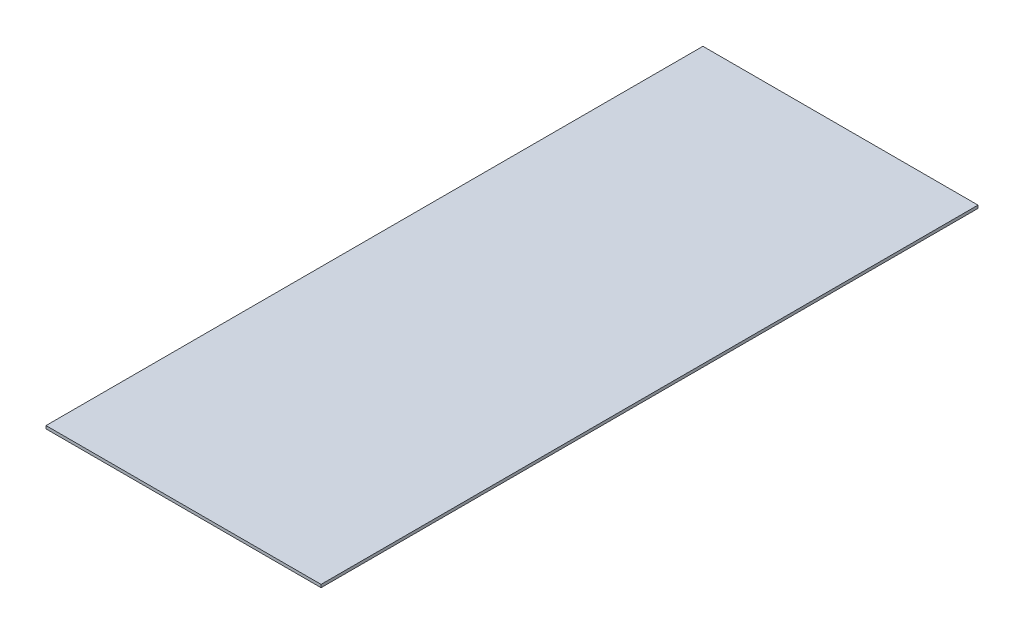
ISO-10303-21;
HEADER;
FILE_DESCRIPTION(('STEP AP214'),'2;1');
FILE_NAME('part.step','',(''),(''),'','','');
FILE_SCHEMA(('AUTOMOTIVE_DESIGN { 1 0 10303 214 1 1 1 1 }'));
ENDSEC;
DATA;
#1=APPLICATION_CONTEXT('core data for automotive mechanical design processes');
#2=APPLICATION_PROTOCOL_DEFINITION('international standard','automotive_design',2000,#1);
#3=PRODUCT_CONTEXT('',#1,'mechanical');
#4=PRODUCT('Part','Part','',(#3));
#5=PRODUCT_RELATED_PRODUCT_CATEGORY('part','',(#4));
#6=PRODUCT_DEFINITION_FORMATION('','',#4);
#7=PRODUCT_DEFINITION_CONTEXT('part definition',#1,'design');
#8=PRODUCT_DEFINITION('design','',#6,#7);
#9=PRODUCT_DEFINITION_SHAPE('','',#8);
#10=(LENGTH_UNIT() NAMED_UNIT(*) SI_UNIT(.MILLI.,.METRE.));
#11=(NAMED_UNIT(*) PLANE_ANGLE_UNIT() SI_UNIT($,.RADIAN.));
#12=(NAMED_UNIT(*) SI_UNIT($,.STERADIAN.) SOLID_ANGLE_UNIT());
#13=UNCERTAINTY_MEASURE_WITH_UNIT(LENGTH_MEASURE(1.E-05),#10,'distance_accuracy_value','');
#14=(GEOMETRIC_REPRESENTATION_CONTEXT(3) GLOBAL_UNCERTAINTY_ASSIGNED_CONTEXT((#13)) GLOBAL_UNIT_ASSIGNED_CONTEXT((#10,
#11,#12)) REPRESENTATION_CONTEXT('',''));
#15=CARTESIAN_POINT('',(0.,0.,0.));
#16=DIRECTION('',(0.,0.,1.));
#17=DIRECTION('',(1.,0.,0.));
#18=AXIS2_PLACEMENT_3D('',#15,#16,#17);
#19=CARTESIAN_POINT('',(0.,0.18,0.));
#20=DIRECTION('',(1.,0.,0.));
#21=DIRECTION('',(0.,0.,-1.));
#22=AXIS2_PLACEMENT_3D('',#19,#20,#21);
#23=PLANE('',#22);
#24=DIRECTION('',(0.,0.,1.));
#25=VECTOR('',#24,1.);
#26=CARTESIAN_POINT('',(0.,0.,0.));
#27=LINE('',#26,#25);
#28=CARTESIAN_POINT('',(0.,0.,-40.6));
#29=VERTEX_POINT('',#28);
#30=CARTESIAN_POINT('',(0.,0.,0.));
#31=VERTEX_POINT('',#30);
#32=EDGE_CURVE('E95',#29,#31,#27,.T.);
#33=ORIENTED_EDGE('',*,*,#32,.T.);
#34=DIRECTION('',(0.,-1.,0.));
#35=VECTOR('',#34,1.);
#36=CARTESIAN_POINT('',(0.,0.18,0.));
#37=LINE('',#36,#35);
#38=CARTESIAN_POINT('',(0.,0.18,0.));
#39=VERTEX_POINT('',#38);
#40=EDGE_CURVE('E11',#39,#31,#37,.T.);
#41=ORIENTED_EDGE('',*,*,#40,.F.);
#42=DIRECTION('',(0.,0.,1.));
#43=VECTOR('',#42,1.);
#44=CARTESIAN_POINT('',(0.,0.18,0.));
#45=LINE('',#44,#43);
#46=CARTESIAN_POINT('',(0.,0.18,-40.6));
#47=VERTEX_POINT('',#46);
#48=EDGE_CURVE('E83',#47,#39,#45,.T.);
#49=ORIENTED_EDGE('',*,*,#48,.F.);
#50=DIRECTION('',(0.,-1.,0.));
#51=VECTOR('',#50,1.);
#52=CARTESIAN_POINT('',(0.,0.18,-40.6));
#53=LINE('',#52,#51);
#54=EDGE_CURVE('E91',#47,#29,#53,.T.);
#55=ORIENTED_EDGE('',*,*,#54,.T.);
#56=EDGE_LOOP('',(#33,#41,#49,#55));
#57=FACE_BOUND('',#56,.T.);
#58=ADVANCED_FACE('F32',(#57),#23,.F.);
#59=CARTESIAN_POINT('',(0.,0.18,0.));
#60=DIRECTION('',(0.,0.,-1.));
#61=DIRECTION('',(-1.,0.,0.));
#62=AXIS2_PLACEMENT_3D('',#59,#60,#61);
#63=PLANE('',#62);
#64=DIRECTION('',(1.,0.,0.));
#65=VECTOR('',#64,1.);
#66=CARTESIAN_POINT('',(0.,0.,0.));
#67=LINE('',#66,#65);
#68=CARTESIAN_POINT('',(17.,0.,0.));
#69=VERTEX_POINT('',#68);
#70=EDGE_CURVE('E87',#31,#69,#67,.T.);
#71=ORIENTED_EDGE('',*,*,#70,.T.);
#72=DIRECTION('',(0.,-1.,0.));
#73=VECTOR('',#72,1.);
#74=CARTESIAN_POINT('',(17.,0.18,0.));
#75=LINE('',#74,#73);
#76=CARTESIAN_POINT('',(17.,0.18,0.));
#77=VERTEX_POINT('',#76);
#78=EDGE_CURVE('E40',#77,#69,#75,.T.);
#79=ORIENTED_EDGE('',*,*,#78,.F.);
#80=DIRECTION('',(1.,0.,0.));
#81=VECTOR('',#80,1.);
#82=CARTESIAN_POINT('',(0.,0.18,0.));
#83=LINE('',#82,#81);
#84=EDGE_CURVE('E78',#39,#77,#83,.T.);
#85=ORIENTED_EDGE('',*,*,#84,.F.);
#86=ORIENTED_EDGE('',*,*,#40,.T.);
#87=EDGE_LOOP('',(#71,#79,#85,#86));
#88=FACE_BOUND('',#87,.T.);
#89=ADVANCED_FACE('F86',(#88),#63,.F.);
#90=CARTESIAN_POINT('',(17.,0.18,0.));
#91=DIRECTION('',(-1.,0.,0.));
#92=DIRECTION('',(0.,0.,1.));
#93=AXIS2_PLACEMENT_3D('',#90,#91,#92);
#94=PLANE('',#93);
#95=DIRECTION('',(0.,0.,-1.));
#96=VECTOR('',#95,1.);
#97=CARTESIAN_POINT('',(17.,0.,0.));
#98=LINE('',#97,#96);
#99=CARTESIAN_POINT('',(17.,0.,-40.6));
#100=VERTEX_POINT('',#99);
#101=EDGE_CURVE('E65',#69,#100,#98,.T.);
#102=ORIENTED_EDGE('',*,*,#101,.T.);
#103=DIRECTION('',(0.,-1.,0.));
#104=VECTOR('',#103,1.);
#105=CARTESIAN_POINT('',(17.,0.18,-40.6));
#106=LINE('',#105,#104);
#107=CARTESIAN_POINT('',(17.,0.18,-40.6));
#108=VERTEX_POINT('',#107);
#109=EDGE_CURVE('E88',#108,#100,#106,.T.);
#110=ORIENTED_EDGE('',*,*,#109,.F.);
#111=DIRECTION('',(0.,0.,-1.));
#112=VECTOR('',#111,1.);
#113=CARTESIAN_POINT('',(17.,0.18,0.));
#114=LINE('',#113,#112);
#115=EDGE_CURVE('E81',#77,#108,#114,.T.);
#116=ORIENTED_EDGE('',*,*,#115,.F.);
#117=ORIENTED_EDGE('',*,*,#78,.T.);
#118=EDGE_LOOP('',(#102,#110,#116,#117));
#119=FACE_BOUND('',#118,.T.);
#120=ADVANCED_FACE('F89',(#119),#94,.F.);
#121=CARTESIAN_POINT('',(0.,0.18,-40.6));
#122=DIRECTION('',(0.,0.,1.));
#123=DIRECTION('',(1.,0.,0.));
#124=AXIS2_PLACEMENT_3D('',#121,#122,#123);
#125=PLANE('',#124);
#126=DIRECTION('',(-1.,0.,0.));
#127=VECTOR('',#126,1.);
#128=CARTESIAN_POINT('',(0.,0.,-40.6));
#129=LINE('',#128,#127);
#130=EDGE_CURVE('E71',#100,#29,#129,.T.);
#131=ORIENTED_EDGE('',*,*,#130,.T.);
#132=ORIENTED_EDGE('',*,*,#54,.F.);
#133=DIRECTION('',(-1.,0.,0.));
#134=VECTOR('',#133,1.);
#135=CARTESIAN_POINT('',(0.,0.18,-40.6));
#136=LINE('',#135,#134);
#137=EDGE_CURVE('E48',#108,#47,#136,.T.);
#138=ORIENTED_EDGE('',*,*,#137,.F.);
#139=ORIENTED_EDGE('',*,*,#109,.T.);
#140=EDGE_LOOP('',(#131,#132,#138,#139));
#141=FACE_BOUND('',#140,.T.);
#142=ADVANCED_FACE('F102',(#141),#125,.F.);
#143=CARTESIAN_POINT('',(0.,0.18,0.));
#144=DIRECTION('',(0.,-1.,0.));
#145=DIRECTION('',(0.,0.,-1.));
#146=AXIS2_PLACEMENT_3D('',#143,#144,#145);
#147=PLANE('',#146);
#148=ORIENTED_EDGE('',*,*,#48,.T.);
#149=ORIENTED_EDGE('',*,*,#84,.T.);
#150=ORIENTED_EDGE('',*,*,#115,.T.);
#151=ORIENTED_EDGE('',*,*,#137,.T.);
#152=EDGE_LOOP('',(#148,#149,#150,#151));
#153=FACE_BOUND('',#152,.T.);
#154=ADVANCED_FACE('F79',(#153),#147,.F.);
#155=CARTESIAN_POINT('',(0.,0.,0.));
#156=DIRECTION('',(0.,-1.,0.));
#157=DIRECTION('',(0.,0.,-1.));
#158=AXIS2_PLACEMENT_3D('',#155,#156,#157);
#159=PLANE('',#158);
#160=ORIENTED_EDGE('',*,*,#32,.F.);
#161=ORIENTED_EDGE('',*,*,#130,.F.);
#162=ORIENTED_EDGE('',*,*,#101,.F.);
#163=ORIENTED_EDGE('',*,*,#70,.F.);
#164=EDGE_LOOP('',(#160,#161,#162,#163));
#165=FACE_BOUND('',#164,.T.);
#166=ADVANCED_FACE('F105',(#165),#159,.T.);
#167=CLOSED_SHELL('',(#58,#89,#120,#142,#154,#166));
#168=MANIFOLD_SOLID_BREP('B2',#167);
#169=ADVANCED_BREP_SHAPE_REPRESENTATION('',(#18,#168),#14);
#170=SHAPE_DEFINITION_REPRESENTATION(#9,#169);
ENDSEC;
END-ISO-10303-21;
